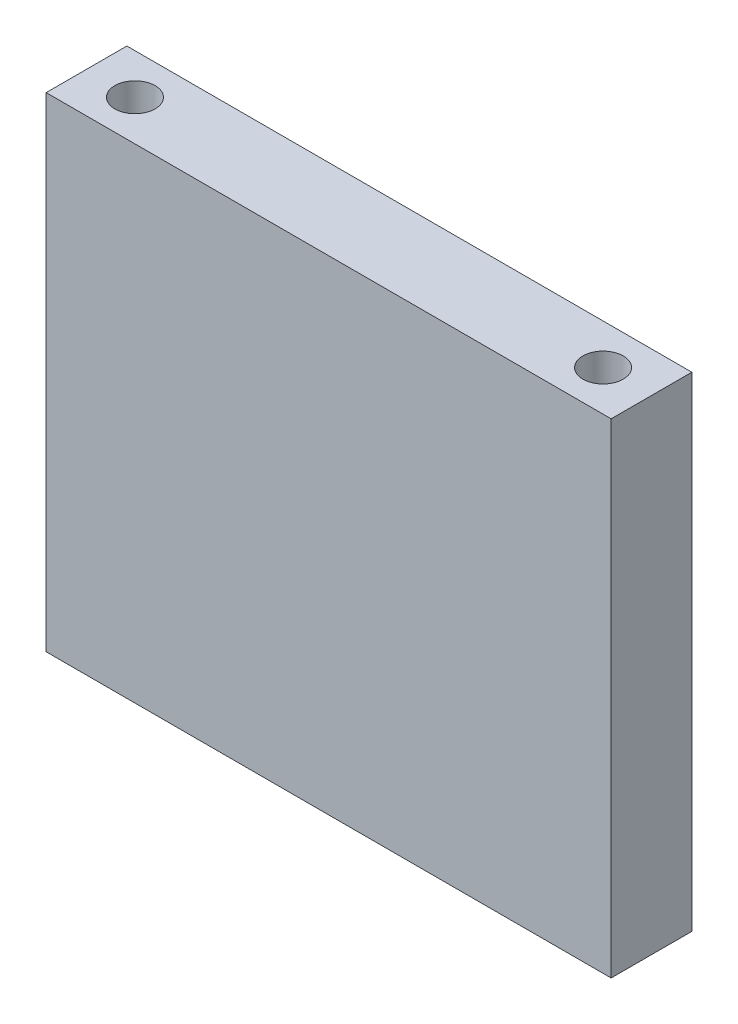
ISO-10303-21;
HEADER;
FILE_DESCRIPTION(('STEP AP214'),'2;1');
FILE_NAME('part.step','',(''),(''),'','','');
FILE_SCHEMA(('AUTOMOTIVE_DESIGN { 1 0 10303 214 1 1 1 1 }'));
ENDSEC;
DATA;
#1=APPLICATION_CONTEXT('core data for automotive mechanical design processes');
#2=APPLICATION_PROTOCOL_DEFINITION('international standard','automotive_design',2000,#1);
#3=PRODUCT_CONTEXT('',#1,'mechanical');
#4=PRODUCT('Part','Part','',(#3));
#5=PRODUCT_RELATED_PRODUCT_CATEGORY('part','',(#4));
#6=PRODUCT_DEFINITION_FORMATION('','',#4);
#7=PRODUCT_DEFINITION_CONTEXT('part definition',#1,'design');
#8=PRODUCT_DEFINITION('design','',#6,#7);
#9=PRODUCT_DEFINITION_SHAPE('','',#8);
#10=(LENGTH_UNIT() NAMED_UNIT(*) SI_UNIT(.MILLI.,.METRE.));
#11=(NAMED_UNIT(*) PLANE_ANGLE_UNIT() SI_UNIT($,.RADIAN.));
#12=(NAMED_UNIT(*) SI_UNIT($,.STERADIAN.) SOLID_ANGLE_UNIT());
#13=UNCERTAINTY_MEASURE_WITH_UNIT(LENGTH_MEASURE(1.E-05),#10,'distance_accuracy_value','');
#14=(GEOMETRIC_REPRESENTATION_CONTEXT(3) GLOBAL_UNCERTAINTY_ASSIGNED_CONTEXT((#13)) GLOBAL_UNIT_ASSIGNED_CONTEXT((#10,
#11,#12)) REPRESENTATION_CONTEXT('',''));
#15=CARTESIAN_POINT('',(0.,0.,0.));
#16=DIRECTION('',(0.,0.,1.));
#17=DIRECTION('',(1.,0.,0.));
#18=AXIS2_PLACEMENT_3D('',#15,#16,#17);
#19=CARTESIAN_POINT('',(35.,30.,-10.));
#20=DIRECTION('',(1.,0.,0.));
#21=DIRECTION('',(0.,1.,0.));
#22=AXIS2_PLACEMENT_3D('',#19,#20,#21);
#23=PLANE('',#22);
#24=DIRECTION('',(0.,1.,0.));
#25=VECTOR('',#24,1.);
#26=CARTESIAN_POINT('',(35.,30.,0.));
#27=LINE('',#26,#25);
#28=CARTESIAN_POINT('',(35.,-30.,0.));
#29=VERTEX_POINT('',#28);
#30=CARTESIAN_POINT('',(35.,30.,0.));
#31=VERTEX_POINT('',#30);
#32=EDGE_CURVE('E100',#29,#31,#27,.T.);
#33=ORIENTED_EDGE('',*,*,#32,.F.);
#34=DIRECTION('',(0.,0.,1.));
#35=VECTOR('',#34,1.);
#36=CARTESIAN_POINT('',(35.,-30.,-10.));
#37=LINE('',#36,#35);
#38=CARTESIAN_POINT('',(35.,-30.,-10.));
#39=VERTEX_POINT('',#38);
#40=EDGE_CURVE('E11',#39,#29,#37,.T.);
#41=ORIENTED_EDGE('',*,*,#40,.F.);
#42=DIRECTION('',(0.,1.,0.));
#43=VECTOR('',#42,1.);
#44=CARTESIAN_POINT('',(35.,30.,-10.));
#45=LINE('',#44,#43);
#46=CARTESIAN_POINT('',(35.,30.,-10.));
#47=VERTEX_POINT('',#46);
#48=EDGE_CURVE('E93',#39,#47,#45,.T.);
#49=ORIENTED_EDGE('',*,*,#48,.T.);
#50=DIRECTION('',(0.,0.,1.));
#51=VECTOR('',#50,1.);
#52=CARTESIAN_POINT('',(35.,30.,-10.));
#53=LINE('',#52,#51);
#54=EDGE_CURVE('E38',#47,#31,#53,.T.);
#55=ORIENTED_EDGE('',*,*,#54,.T.);
#56=EDGE_LOOP('',(#33,#41,#49,#55));
#57=FACE_BOUND('',#56,.T.);
#58=ADVANCED_FACE('F35',(#57),#23,.T.);
#59=CARTESIAN_POINT('',(-35.,-30.,-10.));
#60=DIRECTION('',(0.,-1.,0.));
#61=DIRECTION('',(1.,0.,0.));
#62=AXIS2_PLACEMENT_3D('',#59,#60,#61);
#63=PLANE('',#62);
#64=CARTESIAN_POINT('',(-29.,-30.,-5.));
#65=DIRECTION('',(0.,1.,0.));
#66=DIRECTION('',(-1.,0.,0.));
#67=AXIS2_PLACEMENT_3D('',#64,#65,#66);
#68=CIRCLE('',#67,2.5);
#69=CARTESIAN_POINT('',(-31.5,-30.,-5.));
#70=VERTEX_POINT('',#69);
#71=EDGE_CURVE('E104',#70,#70,#68,.T.);
#72=ORIENTED_EDGE('',*,*,#71,.T.);
#73=EDGE_LOOP('',(#72));
#74=FACE_BOUND('',#73,.T.);
#75=CARTESIAN_POINT('',(29.,-30.,-5.));
#76=DIRECTION('',(0.,1.,0.));
#77=DIRECTION('',(1.,0.,0.));
#78=AXIS2_PLACEMENT_3D('',#75,#76,#77);
#79=CIRCLE('',#78,2.5);
#80=CARTESIAN_POINT('',(26.5,-30.,-5.));
#81=VERTEX_POINT('',#80);
#82=EDGE_CURVE('E137',#81,#81,#79,.T.);
#83=ORIENTED_EDGE('',*,*,#82,.T.);
#84=EDGE_LOOP('',(#83));
#85=FACE_BOUND('',#84,.T.);
#86=DIRECTION('',(1.,0.,0.));
#87=VECTOR('',#86,1.);
#88=CARTESIAN_POINT('',(-35.,-30.,0.));
#89=LINE('',#88,#87);
#90=CARTESIAN_POINT('',(-35.,-30.,0.));
#91=VERTEX_POINT('',#90);
#92=EDGE_CURVE('E95',#91,#29,#89,.T.);
#93=ORIENTED_EDGE('',*,*,#92,.F.);
#94=DIRECTION('',(0.,0.,1.));
#95=VECTOR('',#94,1.);
#96=CARTESIAN_POINT('',(-35.,-30.,-10.));
#97=LINE('',#96,#95);
#98=CARTESIAN_POINT('',(-35.,-30.,-10.));
#99=VERTEX_POINT('',#98);
#100=EDGE_CURVE('E44',#99,#91,#97,.T.);
#101=ORIENTED_EDGE('',*,*,#100,.F.);
#102=DIRECTION('',(1.,0.,0.));
#103=VECTOR('',#102,1.);
#104=CARTESIAN_POINT('',(-35.,-30.,-10.));
#105=LINE('',#104,#103);
#106=EDGE_CURVE('E90',#99,#39,#105,.T.);
#107=ORIENTED_EDGE('',*,*,#106,.T.);
#108=ORIENTED_EDGE('',*,*,#40,.T.);
#109=EDGE_LOOP('',(#93,#101,#107,#108));
#110=FACE_BOUND('',#109,.T.);
#111=ADVANCED_FACE('F111',(#74,#85,#110),#63,.T.);
#112=CARTESIAN_POINT('',(-35.,30.,-10.));
#113=DIRECTION('',(-1.,0.,0.));
#114=DIRECTION('',(0.,-1.,0.));
#115=AXIS2_PLACEMENT_3D('',#112,#113,#114);
#116=PLANE('',#115);
#117=DIRECTION('',(0.,-1.,0.));
#118=VECTOR('',#117,1.);
#119=CARTESIAN_POINT('',(-35.,30.,0.));
#120=LINE('',#119,#118);
#121=CARTESIAN_POINT('',(-35.,30.,0.));
#122=VERTEX_POINT('',#121);
#123=EDGE_CURVE('E85',#122,#91,#120,.T.);
#124=ORIENTED_EDGE('',*,*,#123,.F.);
#125=DIRECTION('',(0.,0.,1.));
#126=VECTOR('',#125,1.);
#127=CARTESIAN_POINT('',(-35.,30.,-10.));
#128=LINE('',#127,#126);
#129=CARTESIAN_POINT('',(-35.,30.,-10.));
#130=VERTEX_POINT('',#129);
#131=EDGE_CURVE('E80',#130,#122,#128,.T.);
#132=ORIENTED_EDGE('',*,*,#131,.F.);
#133=DIRECTION('',(0.,-1.,0.));
#134=VECTOR('',#133,1.);
#135=CARTESIAN_POINT('',(-35.,30.,-10.));
#136=LINE('',#135,#134);
#137=EDGE_CURVE('E83',#130,#99,#136,.T.);
#138=ORIENTED_EDGE('',*,*,#137,.T.);
#139=ORIENTED_EDGE('',*,*,#100,.T.);
#140=EDGE_LOOP('',(#124,#132,#138,#139));
#141=FACE_BOUND('',#140,.T.);
#142=ADVANCED_FACE('F82',(#141),#116,.T.);
#143=CARTESIAN_POINT('',(-35.,30.,-10.));
#144=DIRECTION('',(0.,1.,0.));
#145=DIRECTION('',(0.,0.,1.));
#146=AXIS2_PLACEMENT_3D('',#143,#144,#145);
#147=PLANE('',#146);
#148=CARTESIAN_POINT('',(-29.,30.,-5.));
#149=DIRECTION('',(0.,1.,0.));
#150=DIRECTION('',(-1.,0.,0.));
#151=AXIS2_PLACEMENT_3D('',#148,#149,#150);
#152=CIRCLE('',#151,2.5);
#153=CARTESIAN_POINT('',(-31.5,30.,-5.));
#154=VERTEX_POINT('',#153);
#155=EDGE_CURVE('E132',#154,#154,#152,.T.);
#156=ORIENTED_EDGE('',*,*,#155,.F.);
#157=EDGE_LOOP('',(#156));
#158=FACE_BOUND('',#157,.T.);
#159=CARTESIAN_POINT('',(29.,30.,-5.));
#160=DIRECTION('',(0.,1.,0.));
#161=DIRECTION('',(1.,0.,0.));
#162=AXIS2_PLACEMENT_3D('',#159,#160,#161);
#163=CIRCLE('',#162,2.5);
#164=CARTESIAN_POINT('',(26.5,30.,-5.));
#165=VERTEX_POINT('',#164);
#166=EDGE_CURVE('E135',#165,#165,#163,.T.);
#167=ORIENTED_EDGE('',*,*,#166,.F.);
#168=EDGE_LOOP('',(#167));
#169=FACE_BOUND('',#168,.T.);
#170=DIRECTION('',(-1.,0.,0.));
#171=VECTOR('',#170,1.);
#172=CARTESIAN_POINT('',(-35.,30.,0.));
#173=LINE('',#172,#171);
#174=EDGE_CURVE('E103',#31,#122,#173,.T.);
#175=ORIENTED_EDGE('',*,*,#174,.F.);
#176=ORIENTED_EDGE('',*,*,#54,.F.);
#177=DIRECTION('',(-1.,0.,0.));
#178=VECTOR('',#177,1.);
#179=CARTESIAN_POINT('',(-35.,30.,-10.));
#180=LINE('',#179,#178);
#181=EDGE_CURVE('E89',#47,#130,#180,.T.);
#182=ORIENTED_EDGE('',*,*,#181,.T.);
#183=ORIENTED_EDGE('',*,*,#131,.T.);
#184=EDGE_LOOP('',(#175,#176,#182,#183));
#185=FACE_BOUND('',#184,.T.);
#186=ADVANCED_FACE('F92',(#158,#169,#185),#147,.T.);
#187=CARTESIAN_POINT('',(0.,0.,-10.));
#188=DIRECTION('',(0.,0.,1.));
#189=DIRECTION('',(1.,0.,0.));
#190=AXIS2_PLACEMENT_3D('',#187,#188,#189);
#191=PLANE('',#190);
#192=ORIENTED_EDGE('',*,*,#48,.F.);
#193=ORIENTED_EDGE('',*,*,#106,.F.);
#194=ORIENTED_EDGE('',*,*,#137,.F.);
#195=ORIENTED_EDGE('',*,*,#181,.F.);
#196=EDGE_LOOP('',(#192,#193,#194,#195));
#197=FACE_BOUND('',#196,.T.);
#198=ADVANCED_FACE('F88',(#197),#191,.F.);
#199=CARTESIAN_POINT('',(0.,0.,0.));
#200=DIRECTION('',(0.,0.,1.));
#201=DIRECTION('',(1.,0.,0.));
#202=AXIS2_PLACEMENT_3D('',#199,#200,#201);
#203=PLANE('',#202);
#204=ORIENTED_EDGE('',*,*,#32,.T.);
#205=ORIENTED_EDGE('',*,*,#174,.T.);
#206=ORIENTED_EDGE('',*,*,#123,.T.);
#207=ORIENTED_EDGE('',*,*,#92,.T.);
#208=EDGE_LOOP('',(#204,#205,#206,#207));
#209=FACE_BOUND('',#208,.T.);
#210=ADVANCED_FACE('F110',(#209),#203,.T.);
#211=CARTESIAN_POINT('',(29.,-30.,-5.));
#212=DIRECTION('',(0.,1.,0.));
#213=DIRECTION('',(-1.,0.,0.));
#214=AXIS2_PLACEMENT_3D('',#211,#212,#213);
#215=CYLINDRICAL_SURFACE('',#214,2.5);
#216=CARTESIAN_POINT('',(26.5,-30.,-5.));
#217=CARTESIAN_POINT('',(26.5,-29.375,-5.));
#218=CARTESIAN_POINT('',(26.5,-28.75,-5.));
#219=CARTESIAN_POINT('',(26.5,-27.5,-5.));
#220=CARTESIAN_POINT('',(26.5,-26.875,-5.));
#221=CARTESIAN_POINT('',(26.5,-25.625,-5.));
#222=CARTESIAN_POINT('',(26.5,-25.,-5.));
#223=CARTESIAN_POINT('',(26.5,-23.75,-5.));
#224=CARTESIAN_POINT('',(26.5,-23.125,-5.));
#225=CARTESIAN_POINT('',(26.5,-21.875,-5.));
#226=CARTESIAN_POINT('',(26.5,-21.25,-5.));
#227=CARTESIAN_POINT('',(26.5,-20.,-5.));
#228=CARTESIAN_POINT('',(26.5,-19.375,-5.));
#229=CARTESIAN_POINT('',(26.5,-18.125,-5.));
#230=CARTESIAN_POINT('',(26.5,-17.5,-5.));
#231=CARTESIAN_POINT('',(26.5,-16.25,-5.));
#232=CARTESIAN_POINT('',(26.5,-15.625,-5.));
#233=CARTESIAN_POINT('',(26.5,-14.375,-5.));
#234=CARTESIAN_POINT('',(26.5,-13.75,-5.));
#235=CARTESIAN_POINT('',(26.5,-12.5,-5.));
#236=CARTESIAN_POINT('',(26.5,-11.875,-5.));
#237=CARTESIAN_POINT('',(26.5,-10.625,-5.));
#238=CARTESIAN_POINT('',(26.5,-10.,-5.));
#239=CARTESIAN_POINT('',(26.5,-8.75,-5.));
#240=CARTESIAN_POINT('',(26.5,-8.125,-5.));
#241=CARTESIAN_POINT('',(26.5,-6.875,-5.));
#242=CARTESIAN_POINT('',(26.5,-6.25,-5.));
#243=CARTESIAN_POINT('',(26.5,-5.,-5.));
#244=CARTESIAN_POINT('',(26.5,-4.375,-5.));
#245=CARTESIAN_POINT('',(26.5,-3.125,-5.));
#246=CARTESIAN_POINT('',(26.5,-2.5,-5.));
#247=CARTESIAN_POINT('',(26.5,-1.25,-5.));
#248=CARTESIAN_POINT('',(26.5,-0.625000000000004,-5.));
#249=CARTESIAN_POINT('',(26.5,0.624999999999996,-5.));
#250=CARTESIAN_POINT('',(26.5,1.25,-5.));
#251=CARTESIAN_POINT('',(26.5,2.5,-5.));
#252=CARTESIAN_POINT('',(26.5,3.125,-5.));
#253=CARTESIAN_POINT('',(26.5,4.37499999999999,-5.));
#254=CARTESIAN_POINT('',(26.5,4.99999999999999,-5.));
#255=CARTESIAN_POINT('',(26.5,6.24999999999999,-5.));
#256=CARTESIAN_POINT('',(26.5,6.87499999999999,-5.));
#257=CARTESIAN_POINT('',(26.5,8.12499999999999,-5.));
#258=CARTESIAN_POINT('',(26.5,8.74999999999999,-5.));
#259=CARTESIAN_POINT('',(26.5,9.99999999999999,-5.));
#260=CARTESIAN_POINT('',(26.5,10.625,-5.));
#261=CARTESIAN_POINT('',(26.5,11.875,-5.));
#262=CARTESIAN_POINT('',(26.5,12.5,-5.));
#263=CARTESIAN_POINT('',(26.5,13.75,-5.));
#264=CARTESIAN_POINT('',(26.5,14.375,-5.));
#265=CARTESIAN_POINT('',(26.5,15.625,-5.));
#266=CARTESIAN_POINT('',(26.5,16.25,-5.));
#267=CARTESIAN_POINT('',(26.5,17.5,-5.));
#268=CARTESIAN_POINT('',(26.5,18.125,-5.));
#269=CARTESIAN_POINT('',(26.5,19.375,-5.));
#270=CARTESIAN_POINT('',(26.5,20.,-5.));
#271=CARTESIAN_POINT('',(26.5,21.25,-5.));
#272=CARTESIAN_POINT('',(26.5,21.875,-5.));
#273=CARTESIAN_POINT('',(26.5,23.125,-5.));
#274=CARTESIAN_POINT('',(26.5,23.75,-5.));
#275=CARTESIAN_POINT('',(26.5,25.,-5.));
#276=CARTESIAN_POINT('',(26.5,25.625,-5.));
#277=CARTESIAN_POINT('',(26.5,26.875,-5.));
#278=CARTESIAN_POINT('',(26.5,27.5,-5.));
#279=CARTESIAN_POINT('',(26.5,28.75,-5.));
#280=CARTESIAN_POINT('',(26.5,29.375,-5.));
#281=CARTESIAN_POINT('',(26.5,30.,-5.));
#282=B_SPLINE_CURVE_WITH_KNOTS('',3,(#216,#217,#218,#219,#220,#221,#222,#223,#224,#225,#226,
#227,#228,#229,#230,#231,#232,#233,#234,#235,#236,#237,#238,#239,#240,#241,#242,#243,#244,#245,
#246,#247,#248,#249,#250,#251,#252,#253,#254,#255,#256,#257,#258,#259,#260,#261,#262,#263,#264,
#265,#266,#267,#268,#269,#270,#271,#272,#273,#274,#275,#276,#277,#278,#279,#280,#281),
.UNSPECIFIED.,.F.,.F.,(4,2,2,2,2,2,2,2,2,2,2,2,2,2,2,2,2,2,2,2,2,2,2,2,2,2,2,2,2,2,2,2,4),(0.,
1.875,3.75,5.625,7.5,9.375,11.25,13.125,15.,16.875,18.75,20.625,22.5,24.375,26.25,28.125,30.,
31.875,33.75,35.625,37.5,39.375,41.25,43.125,45.,46.875,48.75,50.625,52.5,54.375,56.25,58.125,
60.),.UNSPECIFIED.);
#283=EDGE_CURVE('BSEAM147',#81,#165,#282,.T.);
#284=ORIENTED_EDGE('',*,*,#82,.F.);
#285=ORIENTED_EDGE('',*,*,#166,.T.);
#286=ORIENTED_EDGE('',*,*,#283,.T.);
#287=ORIENTED_EDGE('',*,*,#283,.F.);
#288=EDGE_LOOP('',(#284,#286,#285,#287));
#289=FACE_BOUND('',#288,.T.);
#290=ADVANCED_FACE('F147',(#289),#215,.F.);
#291=CARTESIAN_POINT('',(-29.,-30.,-5.));
#292=DIRECTION('',(0.,1.,0.));
#293=DIRECTION('',(-1.,0.,0.));
#294=AXIS2_PLACEMENT_3D('',#291,#292,#293);
#295=CYLINDRICAL_SURFACE('',#294,2.5);
#296=CARTESIAN_POINT('',(-31.5,-30.,-5.));
#297=CARTESIAN_POINT('',(-31.5,-29.375,-5.));
#298=CARTESIAN_POINT('',(-31.5,-28.75,-5.));
#299=CARTESIAN_POINT('',(-31.5,-27.5,-5.));
#300=CARTESIAN_POINT('',(-31.5,-26.875,-5.));
#301=CARTESIAN_POINT('',(-31.5,-25.625,-5.));
#302=CARTESIAN_POINT('',(-31.5,-25.,-5.));
#303=CARTESIAN_POINT('',(-31.5,-23.75,-5.));
#304=CARTESIAN_POINT('',(-31.5,-23.125,-5.));
#305=CARTESIAN_POINT('',(-31.5,-21.875,-5.));
#306=CARTESIAN_POINT('',(-31.5,-21.25,-5.));
#307=CARTESIAN_POINT('',(-31.5,-20.,-5.));
#308=CARTESIAN_POINT('',(-31.5,-19.375,-5.));
#309=CARTESIAN_POINT('',(-31.5,-18.125,-5.));
#310=CARTESIAN_POINT('',(-31.5,-17.5,-5.));
#311=CARTESIAN_POINT('',(-31.5,-16.25,-5.));
#312=CARTESIAN_POINT('',(-31.5,-15.625,-5.));
#313=CARTESIAN_POINT('',(-31.5,-14.375,-5.));
#314=CARTESIAN_POINT('',(-31.5,-13.75,-5.));
#315=CARTESIAN_POINT('',(-31.5,-12.5,-5.));
#316=CARTESIAN_POINT('',(-31.5,-11.875,-5.));
#317=CARTESIAN_POINT('',(-31.5,-10.625,-5.));
#318=CARTESIAN_POINT('',(-31.5,-10.,-5.));
#319=CARTESIAN_POINT('',(-31.5,-8.75000000000001,-5.));
#320=CARTESIAN_POINT('',(-31.5,-8.12500000000001,-5.));
#321=CARTESIAN_POINT('',(-31.5,-6.87500000000001,-5.));
#322=CARTESIAN_POINT('',(-31.5,-6.25000000000001,-5.));
#323=CARTESIAN_POINT('',(-31.5,-5.00000000000001,-5.));
#324=CARTESIAN_POINT('',(-31.5,-4.37500000000001,-5.));
#325=CARTESIAN_POINT('',(-31.5,-3.12500000000001,-5.));
#326=CARTESIAN_POINT('',(-31.5,-2.50000000000001,-5.));
#327=CARTESIAN_POINT('',(-31.5,-1.25000000000001,-5.));
#328=CARTESIAN_POINT('',(-31.5,-0.625000000000011,-5.));
#329=CARTESIAN_POINT('',(-31.5,0.624999999999989,-5.));
#330=CARTESIAN_POINT('',(-31.5,1.24999999999999,-5.));
#331=CARTESIAN_POINT('',(-31.5,2.49999999999999,-5.));
#332=CARTESIAN_POINT('',(-31.5,3.12499999999999,-5.));
#333=CARTESIAN_POINT('',(-31.5,4.37499999999999,-5.));
#334=CARTESIAN_POINT('',(-31.5,4.99999999999999,-5.));
#335=CARTESIAN_POINT('',(-31.5,6.24999999999998,-5.));
#336=CARTESIAN_POINT('',(-31.5,6.87499999999998,-5.));
#337=CARTESIAN_POINT('',(-31.5,8.12499999999999,-5.));
#338=CARTESIAN_POINT('',(-31.5,8.74999999999999,-5.));
#339=CARTESIAN_POINT('',(-31.5,9.99999999999999,-5.));
#340=CARTESIAN_POINT('',(-31.5,10.625,-5.));
#341=CARTESIAN_POINT('',(-31.5,11.875,-5.));
#342=CARTESIAN_POINT('',(-31.5,12.5,-5.));
#343=CARTESIAN_POINT('',(-31.5,13.75,-5.));
#344=CARTESIAN_POINT('',(-31.5,14.375,-5.));
#345=CARTESIAN_POINT('',(-31.5,15.625,-5.));
#346=CARTESIAN_POINT('',(-31.5,16.25,-5.));
#347=CARTESIAN_POINT('',(-31.5,17.5,-5.));
#348=CARTESIAN_POINT('',(-31.5,18.125,-5.));
#349=CARTESIAN_POINT('',(-31.5,19.375,-5.));
#350=CARTESIAN_POINT('',(-31.5,20.,-5.));
#351=CARTESIAN_POINT('',(-31.5,21.25,-5.));
#352=CARTESIAN_POINT('',(-31.5,21.875,-5.));
#353=CARTESIAN_POINT('',(-31.5,23.125,-5.));
#354=CARTESIAN_POINT('',(-31.5,23.75,-5.));
#355=CARTESIAN_POINT('',(-31.5,25.,-5.));
#356=CARTESIAN_POINT('',(-31.5,25.625,-5.));
#357=CARTESIAN_POINT('',(-31.5,26.875,-5.));
#358=CARTESIAN_POINT('',(-31.5,27.5,-5.));
#359=CARTESIAN_POINT('',(-31.5,28.75,-5.));
#360=CARTESIAN_POINT('',(-31.5,29.375,-5.));
#361=CARTESIAN_POINT('',(-31.5,30.,-5.));
#362=B_SPLINE_CURVE_WITH_KNOTS('',3,(#296,#297,#298,#299,#300,#301,#302,#303,#304,#305,#306,
#307,#308,#309,#310,#311,#312,#313,#314,#315,#316,#317,#318,#319,#320,#321,#322,#323,#324,#325,
#326,#327,#328,#329,#330,#331,#332,#333,#334,#335,#336,#337,#338,#339,#340,#341,#342,#343,#344,
#345,#346,#347,#348,#349,#350,#351,#352,#353,#354,#355,#356,#357,#358,#359,#360,#361),
.UNSPECIFIED.,.F.,.F.,(4,2,2,2,2,2,2,2,2,2,2,2,2,2,2,2,2,2,2,2,2,2,2,2,2,2,2,2,2,2,2,2,4),(0.,
1.875,3.75,5.625,7.5,9.375,11.25,13.125,15.,16.875,18.75,20.625,22.5,24.375,26.25,28.125,30.,
31.875,33.75,35.625,37.5,39.375,41.25,43.125,45.,46.875,48.75,50.625,52.5,54.375,56.25,58.125,
60.),.UNSPECIFIED.);
#363=EDGE_CURVE('BSEAM144',#70,#154,#362,.T.);
#364=ORIENTED_EDGE('',*,*,#71,.F.);
#365=ORIENTED_EDGE('',*,*,#155,.T.);
#366=ORIENTED_EDGE('',*,*,#363,.T.);
#367=ORIENTED_EDGE('',*,*,#363,.F.);
#368=EDGE_LOOP('',(#364,#366,#365,#367));
#369=FACE_BOUND('',#368,.T.);
#370=ADVANCED_FACE('F144',(#369),#295,.F.);
#371=CLOSED_SHELL('',(#58,#111,#142,#186,#198,#210,#290,#370));
#372=MANIFOLD_SOLID_BREP('B2',#371);
#373=ADVANCED_BREP_SHAPE_REPRESENTATION('',(#18,#372),#14);
#374=SHAPE_DEFINITION_REPRESENTATION(#9,#373);
ENDSEC;
END-ISO-10303-21;
